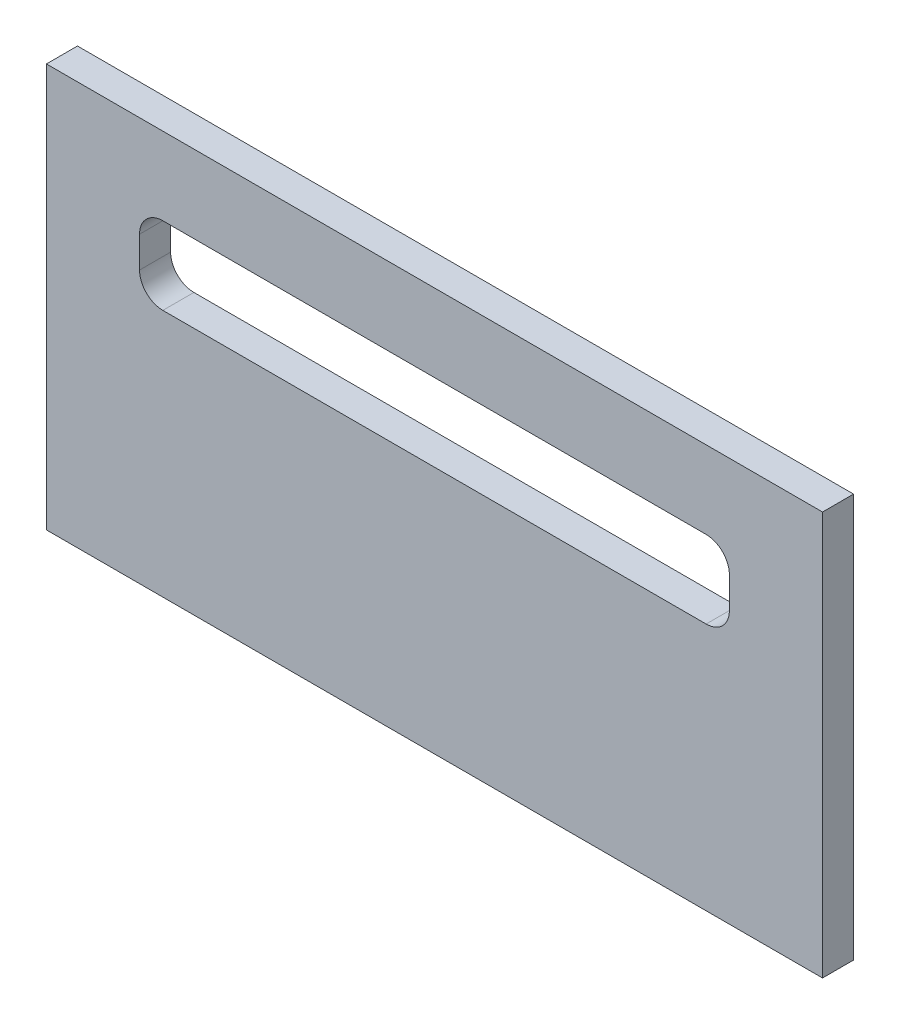
ISO-10303-21;
HEADER;
FILE_DESCRIPTION(('STEP AP214'),'2;1');
FILE_NAME('part.step','',(''),(''),'','','');
FILE_SCHEMA(('AUTOMOTIVE_DESIGN { 1 0 10303 214 1 1 1 1 }'));
ENDSEC;
DATA;
#1=APPLICATION_CONTEXT('core data for automotive mechanical design processes');
#2=APPLICATION_PROTOCOL_DEFINITION('international standard','automotive_design',2000,#1);
#3=PRODUCT_CONTEXT('',#1,'mechanical');
#4=PRODUCT('Part','Part','',(#3));
#5=PRODUCT_RELATED_PRODUCT_CATEGORY('part','',(#4));
#6=PRODUCT_DEFINITION_FORMATION('','',#4);
#7=PRODUCT_DEFINITION_CONTEXT('part definition',#1,'design');
#8=PRODUCT_DEFINITION('design','',#6,#7);
#9=PRODUCT_DEFINITION_SHAPE('','',#8);
#10=(LENGTH_UNIT() NAMED_UNIT(*) SI_UNIT(.MILLI.,.METRE.));
#11=(NAMED_UNIT(*) PLANE_ANGLE_UNIT() SI_UNIT($,.RADIAN.));
#12=(NAMED_UNIT(*) SI_UNIT($,.STERADIAN.) SOLID_ANGLE_UNIT());
#13=UNCERTAINTY_MEASURE_WITH_UNIT(LENGTH_MEASURE(1.E-05),#10,'distance_accuracy_value','');
#14=(GEOMETRIC_REPRESENTATION_CONTEXT(3) GLOBAL_UNCERTAINTY_ASSIGNED_CONTEXT((#13)) GLOBAL_UNIT_ASSIGNED_CONTEXT((#10,
#11,#12)) REPRESENTATION_CONTEXT('',''));
#15=CARTESIAN_POINT('',(0.,0.,0.));
#16=DIRECTION('',(0.,0.,1.));
#17=DIRECTION('',(1.,0.,0.));
#18=AXIS2_PLACEMENT_3D('',#15,#16,#17);
#19=CARTESIAN_POINT('',(0.,0.,10.));
#20=DIRECTION('',(0.,0.,-1.));
#21=DIRECTION('',(-1.,0.,0.));
#22=AXIS2_PLACEMENT_3D('',#19,#20,#21);
#23=PLANE('',#22);
#24=DIRECTION('',(1.,0.,0.));
#25=VECTOR('',#24,1.);
#26=CARTESIAN_POINT('',(-250.,130.,10.));
#27=LINE('',#26,#25);
#28=CARTESIAN_POINT('',(250.,130.,10.));
#29=VERTEX_POINT('',#28);
#30=CARTESIAN_POINT('',(-250.,130.,10.));
#31=VERTEX_POINT('',#30);
#32=EDGE_CURVE('E184',#29,#31,#27,.F.);
#33=ORIENTED_EDGE('',*,*,#32,.T.);
#34=DIRECTION('',(0.,1.,0.));
#35=VECTOR('',#34,1.);
#36=CARTESIAN_POINT('',(-250.,-130.,10.));
#37=LINE('',#36,#35);
#38=CARTESIAN_POINT('',(-250.,-130.,10.));
#39=VERTEX_POINT('',#38);
#40=EDGE_CURVE('E177',#31,#39,#37,.F.);
#41=ORIENTED_EDGE('',*,*,#40,.T.);
#42=DIRECTION('',(1.,0.,0.));
#43=VECTOR('',#42,1.);
#44=CARTESIAN_POINT('',(-250.,-130.,10.));
#45=LINE('',#44,#43);
#46=CARTESIAN_POINT('',(250.,-130.,10.));
#47=VERTEX_POINT('',#46);
#48=EDGE_CURVE('E173',#39,#47,#45,.T.);
#49=ORIENTED_EDGE('',*,*,#48,.T.);
#50=DIRECTION('',(0.,1.,0.));
#51=VECTOR('',#50,1.);
#52=CARTESIAN_POINT('',(250.,-130.,10.));
#53=LINE('',#52,#51);
#54=EDGE_CURVE('E157',#47,#29,#53,.T.);
#55=ORIENTED_EDGE('',*,*,#54,.T.);
#56=EDGE_LOOP('',(#33,#41,#49,#55));
#57=FACE_BOUND('',#56,.T.);
#58=CARTESIAN_POINT('',(175.,45.,10.));
#59=DIRECTION('',(0.,0.,1.));
#60=DIRECTION('',(1.,0.,0.));
#61=AXIS2_PLACEMENT_3D('',#58,#59,#60);
#62=CIRCLE('',#61,15.);
#63=CARTESIAN_POINT('',(190.,45.,10.));
#64=VERTEX_POINT('',#63);
#65=CARTESIAN_POINT('',(175.,30.,10.));
#66=VERTEX_POINT('',#65);
#67=EDGE_CURVE('E160',#64,#66,#62,.F.);
#68=ORIENTED_EDGE('',*,*,#67,.T.);
#69=DIRECTION('',(1.,0.,0.));
#70=VECTOR('',#69,1.);
#71=CARTESIAN_POINT('',(190.,30.,10.));
#72=LINE('',#71,#70);
#73=CARTESIAN_POINT('',(-175.,30.,10.));
#74=VERTEX_POINT('',#73);
#75=EDGE_CURVE('E103',#66,#74,#72,.F.);
#76=ORIENTED_EDGE('',*,*,#75,.T.);
#77=CARTESIAN_POINT('',(-175.,45.,10.));
#78=DIRECTION('',(0.,0.,1.));
#79=DIRECTION('',(1.,0.,0.));
#80=AXIS2_PLACEMENT_3D('',#77,#78,#79);
#81=CIRCLE('',#80,15.);
#82=CARTESIAN_POINT('',(-190.,45.,10.));
#83=VERTEX_POINT('',#82);
#84=EDGE_CURVE('E19',#74,#83,#81,.F.);
#85=ORIENTED_EDGE('',*,*,#84,.T.);
#86=DIRECTION('',(0.,1.,0.));
#87=VECTOR('',#86,1.);
#88=CARTESIAN_POINT('',(-190.,30.,10.));
#89=LINE('',#88,#87);
#90=CARTESIAN_POINT('',(-190.,65.,10.));
#91=VERTEX_POINT('',#90);
#92=EDGE_CURVE('E108',#83,#91,#89,.T.);
#93=ORIENTED_EDGE('',*,*,#92,.T.);
#94=CARTESIAN_POINT('',(-175.,65.,10.));
#95=DIRECTION('',(0.,0.,1.));
#96=DIRECTION('',(1.,0.,0.));
#97=AXIS2_PLACEMENT_3D('',#94,#95,#96);
#98=CIRCLE('',#97,15.);
#99=CARTESIAN_POINT('',(-175.,80.,10.));
#100=VERTEX_POINT('',#99);
#101=EDGE_CURVE('E155',#91,#100,#98,.F.);
#102=ORIENTED_EDGE('',*,*,#101,.T.);
#103=DIRECTION('',(1.,0.,0.));
#104=VECTOR('',#103,1.);
#105=CARTESIAN_POINT('',(190.,80.,10.));
#106=LINE('',#105,#104);
#107=CARTESIAN_POINT('',(175.,80.,10.));
#108=VERTEX_POINT('',#107);
#109=EDGE_CURVE('E129',#100,#108,#106,.T.);
#110=ORIENTED_EDGE('',*,*,#109,.T.);
#111=CARTESIAN_POINT('',(175.,65.,10.));
#112=DIRECTION('',(0.,0.,1.));
#113=DIRECTION('',(1.,0.,0.));
#114=AXIS2_PLACEMENT_3D('',#111,#112,#113);
#115=CIRCLE('',#114,15.);
#116=CARTESIAN_POINT('',(190.,65.,10.));
#117=VERTEX_POINT('',#116);
#118=EDGE_CURVE('E158',#108,#117,#115,.F.);
#119=ORIENTED_EDGE('',*,*,#118,.T.);
#120=DIRECTION('',(0.,1.,0.));
#121=VECTOR('',#120,1.);
#122=CARTESIAN_POINT('',(190.,30.,10.));
#123=LINE('',#122,#121);
#124=EDGE_CURVE('E134',#117,#64,#123,.F.);
#125=ORIENTED_EDGE('',*,*,#124,.T.);
#126=EDGE_LOOP('',(#68,#76,#85,#93,#102,#110,#119,#125));
#127=FACE_BOUND('',#126,.T.);
#128=ADVANCED_FACE('F16',(#57,#127),#23,.F.);
#129=CARTESIAN_POINT('',(-190.,30.,10.));
#130=DIRECTION('',(-1.,0.,0.));
#131=DIRECTION('',(0.,0.,1.));
#132=AXIS2_PLACEMENT_3D('',#129,#130,#131);
#133=PLANE('',#132);
#134=DIRECTION('',(0.,0.,1.));
#135=VECTOR('',#134,1.);
#136=CARTESIAN_POINT('',(-190.,45.,10.));
#137=LINE('',#136,#135);
#138=CARTESIAN_POINT('',(-190.,45.,-10.));
#139=VERTEX_POINT('',#138);
#140=EDGE_CURVE('E111',#83,#139,#137,.F.);
#141=ORIENTED_EDGE('',*,*,#140,.T.);
#142=DIRECTION('',(0.,1.,0.));
#143=VECTOR('',#142,1.);
#144=CARTESIAN_POINT('',(-190.,0.,-10.));
#145=LINE('',#144,#143);
#146=CARTESIAN_POINT('',(-190.,65.,-10.));
#147=VERTEX_POINT('',#146);
#148=EDGE_CURVE('E154',#147,#139,#145,.F.);
#149=ORIENTED_EDGE('',*,*,#148,.F.);
#150=DIRECTION('',(0.,0.,1.));
#151=VECTOR('',#150,1.);
#152=CARTESIAN_POINT('',(-190.,65.,10.));
#153=LINE('',#152,#151);
#154=EDGE_CURVE('E114',#147,#91,#153,.T.);
#155=ORIENTED_EDGE('',*,*,#154,.T.);
#156=ORIENTED_EDGE('',*,*,#92,.F.);
#157=EDGE_LOOP('',(#141,#149,#155,#156));
#158=FACE_BOUND('',#157,.T.);
#159=ADVANCED_FACE('F109',(#158),#133,.F.);
#160=CARTESIAN_POINT('',(-175.,45.,10.));
#161=DIRECTION('',(0.,0.,1.));
#162=DIRECTION('',(1.,0.,0.));
#163=AXIS2_PLACEMENT_3D('',#160,#161,#162);
#164=CYLINDRICAL_SURFACE('',#163,15.);
#165=DIRECTION('',(0.,0.,-1.));
#166=VECTOR('',#165,1.);
#167=CARTESIAN_POINT('',(-175.,30.,10.));
#168=LINE('',#167,#166);
#169=CARTESIAN_POINT('',(-175.,30.,-10.));
#170=VERTEX_POINT('',#169);
#171=EDGE_CURVE('E126',#74,#170,#168,.T.);
#172=ORIENTED_EDGE('',*,*,#171,.T.);
#173=CARTESIAN_POINT('',(-175.,45.,-10.));
#174=DIRECTION('',(0.,0.,1.));
#175=DIRECTION('',(1.,0.,0.));
#176=AXIS2_PLACEMENT_3D('',#173,#174,#175);
#177=CIRCLE('',#176,15.);
#178=EDGE_CURVE('E122',#139,#170,#177,.T.);
#179=ORIENTED_EDGE('',*,*,#178,.F.);
#180=ORIENTED_EDGE('',*,*,#140,.F.);
#181=ORIENTED_EDGE('',*,*,#84,.F.);
#182=EDGE_LOOP('',(#172,#179,#180,#181));
#183=FACE_BOUND('',#182,.T.);
#184=ADVANCED_FACE('F120',(#183),#164,.F.);
#185=CARTESIAN_POINT('',(190.,30.,10.));
#186=DIRECTION('',(0.,-1.,0.));
#187=DIRECTION('',(0.,0.,-1.));
#188=AXIS2_PLACEMENT_3D('',#185,#186,#187);
#189=PLANE('',#188);
#190=ORIENTED_EDGE('',*,*,#171,.F.);
#191=ORIENTED_EDGE('',*,*,#75,.F.);
#192=DIRECTION('',(0.,0.,1.));
#193=VECTOR('',#192,1.);
#194=CARTESIAN_POINT('',(175.,30.,10.));
#195=LINE('',#194,#193);
#196=CARTESIAN_POINT('',(175.,30.,-10.));
#197=VERTEX_POINT('',#196);
#198=EDGE_CURVE('E161',#66,#197,#195,.F.);
#199=ORIENTED_EDGE('',*,*,#198,.T.);
#200=DIRECTION('',(-1.,0.,0.));
#201=VECTOR('',#200,1.);
#202=CARTESIAN_POINT('',(0.,30.,-10.));
#203=LINE('',#202,#201);
#204=EDGE_CURVE('E152',#170,#197,#203,.F.);
#205=ORIENTED_EDGE('',*,*,#204,.F.);
#206=EDGE_LOOP('',(#190,#191,#199,#205));
#207=FACE_BOUND('',#206,.T.);
#208=ADVANCED_FACE('F252',(#207),#189,.F.);
#209=CARTESIAN_POINT('',(175.,45.,10.));
#210=DIRECTION('',(0.,0.,1.));
#211=DIRECTION('',(1.,0.,0.));
#212=AXIS2_PLACEMENT_3D('',#209,#210,#211);
#213=CYLINDRICAL_SURFACE('',#212,15.);
#214=DIRECTION('',(0.,0.,-1.));
#215=VECTOR('',#214,1.);
#216=CARTESIAN_POINT('',(190.,45.,10.));
#217=LINE('',#216,#215);
#218=CARTESIAN_POINT('',(190.,45.,-10.));
#219=VERTEX_POINT('',#218);
#220=EDGE_CURVE('E138',#64,#219,#217,.T.);
#221=ORIENTED_EDGE('',*,*,#220,.T.);
#222=CARTESIAN_POINT('',(175.,45.,-10.));
#223=DIRECTION('',(0.,0.,1.));
#224=DIRECTION('',(1.,0.,0.));
#225=AXIS2_PLACEMENT_3D('',#222,#223,#224);
#226=CIRCLE('',#225,15.);
#227=EDGE_CURVE('E149',#197,#219,#226,.T.);
#228=ORIENTED_EDGE('',*,*,#227,.F.);
#229=ORIENTED_EDGE('',*,*,#198,.F.);
#230=ORIENTED_EDGE('',*,*,#67,.F.);
#231=EDGE_LOOP('',(#221,#228,#229,#230));
#232=FACE_BOUND('',#231,.T.);
#233=ADVANCED_FACE('F248',(#232),#213,.F.);
#234=CARTESIAN_POINT('',(190.,30.,10.));
#235=DIRECTION('',(1.,0.,0.));
#236=DIRECTION('',(0.,0.,-1.));
#237=AXIS2_PLACEMENT_3D('',#234,#235,#236);
#238=PLANE('',#237);
#239=DIRECTION('',(0.,0.,1.));
#240=VECTOR('',#239,1.);
#241=CARTESIAN_POINT('',(190.,65.,10.));
#242=LINE('',#241,#240);
#243=CARTESIAN_POINT('',(190.,65.,-10.));
#244=VERTEX_POINT('',#243);
#245=EDGE_CURVE('E137',#117,#244,#242,.F.);
#246=ORIENTED_EDGE('',*,*,#245,.T.);
#247=DIRECTION('',(0.,1.,0.));
#248=VECTOR('',#247,1.);
#249=CARTESIAN_POINT('',(190.,0.,-10.));
#250=LINE('',#249,#248);
#251=EDGE_CURVE('E148',#219,#244,#250,.T.);
#252=ORIENTED_EDGE('',*,*,#251,.F.);
#253=ORIENTED_EDGE('',*,*,#220,.F.);
#254=ORIENTED_EDGE('',*,*,#124,.F.);
#255=EDGE_LOOP('',(#246,#252,#253,#254));
#256=FACE_BOUND('',#255,.T.);
#257=ADVANCED_FACE('F244',(#256),#238,.F.);
#258=CARTESIAN_POINT('',(175.,65.,10.));
#259=DIRECTION('',(0.,0.,1.));
#260=DIRECTION('',(1.,0.,0.));
#261=AXIS2_PLACEMENT_3D('',#258,#259,#260);
#262=CYLINDRICAL_SURFACE('',#261,15.);
#263=DIRECTION('',(0.,0.,1.));
#264=VECTOR('',#263,1.);
#265=CARTESIAN_POINT('',(175.,80.,10.));
#266=LINE('',#265,#264);
#267=CARTESIAN_POINT('',(175.,80.,-10.));
#268=VERTEX_POINT('',#267);
#269=EDGE_CURVE('E133',#108,#268,#266,.F.);
#270=ORIENTED_EDGE('',*,*,#269,.T.);
#271=CARTESIAN_POINT('',(175.,65.,-10.));
#272=DIRECTION('',(0.,0.,1.));
#273=DIRECTION('',(1.,0.,0.));
#274=AXIS2_PLACEMENT_3D('',#271,#272,#273);
#275=CIRCLE('',#274,15.);
#276=EDGE_CURVE('E145',#244,#268,#275,.T.);
#277=ORIENTED_EDGE('',*,*,#276,.F.);
#278=ORIENTED_EDGE('',*,*,#245,.F.);
#279=ORIENTED_EDGE('',*,*,#118,.F.);
#280=EDGE_LOOP('',(#270,#277,#278,#279));
#281=FACE_BOUND('',#280,.T.);
#282=ADVANCED_FACE('F240',(#281),#262,.F.);
#283=CARTESIAN_POINT('',(190.,80.,10.));
#284=DIRECTION('',(0.,1.,0.));
#285=DIRECTION('',(0.,0.,1.));
#286=AXIS2_PLACEMENT_3D('',#283,#284,#285);
#287=PLANE('',#286);
#288=DIRECTION('',(0.,0.,1.));
#289=VECTOR('',#288,1.);
#290=CARTESIAN_POINT('',(-175.,80.,10.));
#291=LINE('',#290,#289);
#292=CARTESIAN_POINT('',(-175.,80.,-10.));
#293=VERTEX_POINT('',#292);
#294=EDGE_CURVE('E132',#100,#293,#291,.F.);
#295=ORIENTED_EDGE('',*,*,#294,.T.);
#296=DIRECTION('',(-1.,0.,0.));
#297=VECTOR('',#296,1.);
#298=CARTESIAN_POINT('',(0.,80.,-10.));
#299=LINE('',#298,#297);
#300=EDGE_CURVE('E144',#268,#293,#299,.T.);
#301=ORIENTED_EDGE('',*,*,#300,.F.);
#302=ORIENTED_EDGE('',*,*,#269,.F.);
#303=ORIENTED_EDGE('',*,*,#109,.F.);
#304=EDGE_LOOP('',(#295,#301,#302,#303));
#305=FACE_BOUND('',#304,.T.);
#306=ADVANCED_FACE('F236',(#305),#287,.F.);
#307=CARTESIAN_POINT('',(-175.,65.,10.));
#308=DIRECTION('',(0.,0.,1.));
#309=DIRECTION('',(1.,0.,0.));
#310=AXIS2_PLACEMENT_3D('',#307,#308,#309);
#311=CYLINDRICAL_SURFACE('',#310,15.);
#312=ORIENTED_EDGE('',*,*,#154,.F.);
#313=CARTESIAN_POINT('',(-175.,65.,-10.));
#314=DIRECTION('',(0.,0.,1.));
#315=DIRECTION('',(1.,0.,0.));
#316=AXIS2_PLACEMENT_3D('',#313,#314,#315);
#317=CIRCLE('',#316,15.);
#318=EDGE_CURVE('E140',#293,#147,#317,.T.);
#319=ORIENTED_EDGE('',*,*,#318,.F.);
#320=ORIENTED_EDGE('',*,*,#294,.F.);
#321=ORIENTED_EDGE('',*,*,#101,.F.);
#322=EDGE_LOOP('',(#312,#319,#320,#321));
#323=FACE_BOUND('',#322,.T.);
#324=ADVANCED_FACE('F233',(#323),#311,.F.);
#325=CARTESIAN_POINT('',(250.,-130.,10.));
#326=DIRECTION('',(-1.,0.,0.));
#327=DIRECTION('',(0.,0.,1.));
#328=AXIS2_PLACEMENT_3D('',#325,#326,#327);
#329=PLANE('',#328);
#330=DIRECTION('',(0.,0.,-1.));
#331=VECTOR('',#330,1.);
#332=CARTESIAN_POINT('',(250.,130.,10.));
#333=LINE('',#332,#331);
#334=CARTESIAN_POINT('',(250.,130.,-10.));
#335=VERTEX_POINT('',#334);
#336=EDGE_CURVE('E181',#335,#29,#333,.F.);
#337=ORIENTED_EDGE('',*,*,#336,.T.);
#338=ORIENTED_EDGE('',*,*,#54,.F.);
#339=DIRECTION('',(0.,0.,1.));
#340=VECTOR('',#339,1.);
#341=CARTESIAN_POINT('',(250.,-130.,10.));
#342=LINE('',#341,#340);
#343=CARTESIAN_POINT('',(250.,-130.,-10.));
#344=VERTEX_POINT('',#343);
#345=EDGE_CURVE('E175',#47,#344,#342,.F.);
#346=ORIENTED_EDGE('',*,*,#345,.T.);
#347=DIRECTION('',(0.,1.,0.));
#348=VECTOR('',#347,1.);
#349=CARTESIAN_POINT('',(250.,0.,-10.));
#350=LINE('',#349,#348);
#351=EDGE_CURVE('E143',#335,#344,#350,.F.);
#352=ORIENTED_EDGE('',*,*,#351,.F.);
#353=EDGE_LOOP('',(#337,#338,#346,#352));
#354=FACE_BOUND('',#353,.T.);
#355=ADVANCED_FACE('F213',(#354),#329,.F.);
#356=CARTESIAN_POINT('',(-250.,-130.,10.));
#357=DIRECTION('',(0.,1.,0.));
#358=DIRECTION('',(0.,0.,1.));
#359=AXIS2_PLACEMENT_3D('',#356,#357,#358);
#360=PLANE('',#359);
#361=ORIENTED_EDGE('',*,*,#345,.F.);
#362=ORIENTED_EDGE('',*,*,#48,.F.);
#363=DIRECTION('',(0.,0.,-1.));
#364=VECTOR('',#363,1.);
#365=CARTESIAN_POINT('',(-250.,-130.,10.));
#366=LINE('',#365,#364);
#367=CARTESIAN_POINT('',(-250.,-130.,-10.));
#368=VERTEX_POINT('',#367);
#369=EDGE_CURVE('E179',#39,#368,#366,.T.);
#370=ORIENTED_EDGE('',*,*,#369,.T.);
#371=DIRECTION('',(-1.,0.,0.));
#372=VECTOR('',#371,1.);
#373=CARTESIAN_POINT('',(0.,-130.,-10.));
#374=LINE('',#373,#372);
#375=EDGE_CURVE('E196',#344,#368,#374,.T.);
#376=ORIENTED_EDGE('',*,*,#375,.F.);
#377=EDGE_LOOP('',(#361,#362,#370,#376));
#378=FACE_BOUND('',#377,.T.);
#379=ADVANCED_FACE('F209',(#378),#360,.F.);
#380=CARTESIAN_POINT('',(-250.,-130.,10.));
#381=DIRECTION('',(1.,0.,0.));
#382=DIRECTION('',(0.,0.,-1.));
#383=AXIS2_PLACEMENT_3D('',#380,#381,#382);
#384=PLANE('',#383);
#385=ORIENTED_EDGE('',*,*,#369,.F.);
#386=ORIENTED_EDGE('',*,*,#40,.F.);
#387=DIRECTION('',(0.,0.,-1.));
#388=VECTOR('',#387,1.);
#389=CARTESIAN_POINT('',(-250.,130.,10.));
#390=LINE('',#389,#388);
#391=CARTESIAN_POINT('',(-250.,130.,-10.));
#392=VERTEX_POINT('',#391);
#393=EDGE_CURVE('E34',#31,#392,#390,.T.);
#394=ORIENTED_EDGE('',*,*,#393,.T.);
#395=DIRECTION('',(0.,1.,0.));
#396=VECTOR('',#395,1.);
#397=CARTESIAN_POINT('',(-250.,0.,-10.));
#398=LINE('',#397,#396);
#399=EDGE_CURVE('E25',#368,#392,#398,.T.);
#400=ORIENTED_EDGE('',*,*,#399,.F.);
#401=EDGE_LOOP('',(#385,#386,#394,#400));
#402=FACE_BOUND('',#401,.T.);
#403=ADVANCED_FACE('F205',(#402),#384,.F.);
#404=CARTESIAN_POINT('',(-250.,130.,10.));
#405=DIRECTION('',(0.,-1.,0.));
#406=DIRECTION('',(0.,0.,-1.));
#407=AXIS2_PLACEMENT_3D('',#404,#405,#406);
#408=PLANE('',#407);
#409=ORIENTED_EDGE('',*,*,#393,.F.);
#410=ORIENTED_EDGE('',*,*,#32,.F.);
#411=ORIENTED_EDGE('',*,*,#336,.F.);
#412=DIRECTION('',(-1.,0.,0.));
#413=VECTOR('',#412,1.);
#414=CARTESIAN_POINT('',(0.,130.,-10.));
#415=LINE('',#414,#413);
#416=EDGE_CURVE('E11',#392,#335,#415,.F.);
#417=ORIENTED_EDGE('',*,*,#416,.F.);
#418=EDGE_LOOP('',(#409,#410,#411,#417));
#419=FACE_BOUND('',#418,.T.);
#420=ADVANCED_FACE('F217',(#419),#408,.F.);
#421=CARTESIAN_POINT('',(0.,0.,-10.));
#422=DIRECTION('',(0.,0.,-1.));
#423=DIRECTION('',(-1.,0.,0.));
#424=AXIS2_PLACEMENT_3D('',#421,#422,#423);
#425=PLANE('',#424);
#426=ORIENTED_EDGE('',*,*,#399,.T.);
#427=ORIENTED_EDGE('',*,*,#416,.T.);
#428=ORIENTED_EDGE('',*,*,#351,.T.);
#429=ORIENTED_EDGE('',*,*,#375,.T.);
#430=EDGE_LOOP('',(#426,#427,#428,#429));
#431=FACE_BOUND('',#430,.T.);
#432=ORIENTED_EDGE('',*,*,#300,.T.);
#433=ORIENTED_EDGE('',*,*,#318,.T.);
#434=ORIENTED_EDGE('',*,*,#148,.T.);
#435=ORIENTED_EDGE('',*,*,#178,.T.);
#436=ORIENTED_EDGE('',*,*,#204,.T.);
#437=ORIENTED_EDGE('',*,*,#227,.T.);
#438=ORIENTED_EDGE('',*,*,#251,.T.);
#439=ORIENTED_EDGE('',*,*,#276,.T.);
#440=EDGE_LOOP('',(#432,#433,#434,#435,#436,#437,#438,#439));
#441=FACE_BOUND('',#440,.T.);
#442=ADVANCED_FACE('F201',(#431,#441),#425,.T.);
#443=CLOSED_SHELL('',(#128,#159,#184,#208,#233,#257,#282,#306,#324,#355,#379,#403,#420,#442));
#444=MANIFOLD_SOLID_BREP('B1',#443);
#445=ADVANCED_BREP_SHAPE_REPRESENTATION('',(#18,#444),#14);
#446=SHAPE_DEFINITION_REPRESENTATION(#9,#445);
ENDSEC;
END-ISO-10303-21;
